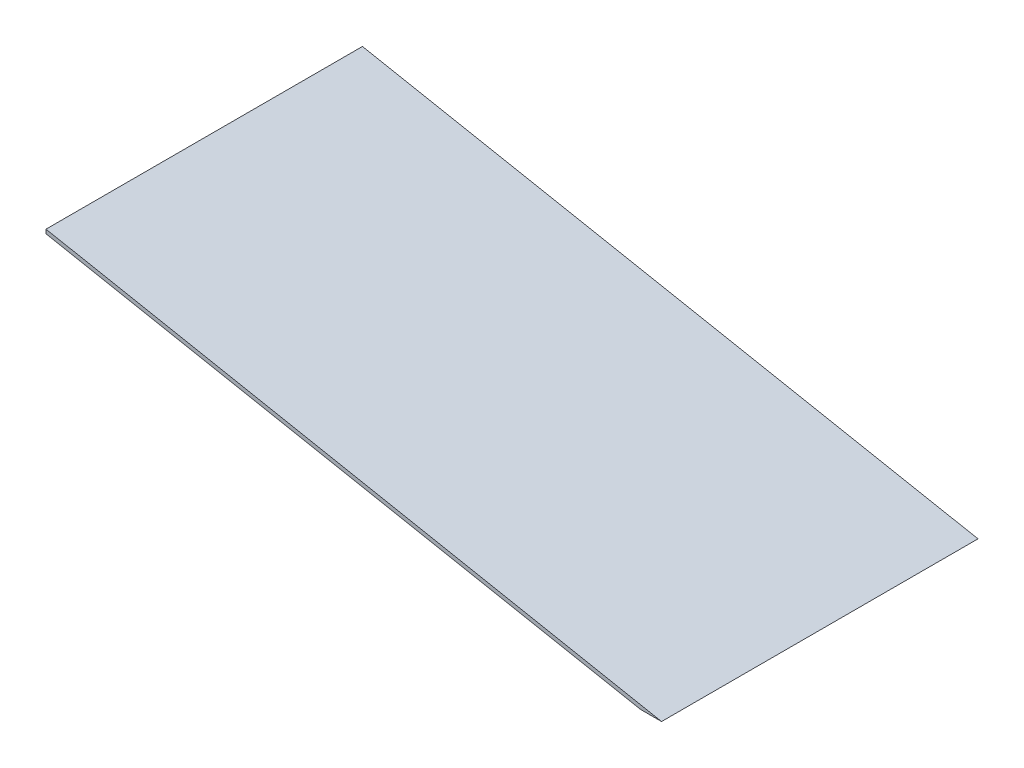
ISO-10303-21;
HEADER;
FILE_DESCRIPTION(('STEP AP214'),'2;1');
FILE_NAME('part.step','',(''),(''),'','','');
FILE_SCHEMA(('AUTOMOTIVE_DESIGN { 1 0 10303 214 1 1 1 1 }'));
ENDSEC;
DATA;
#1=APPLICATION_CONTEXT('core data for automotive mechanical design processes');
#2=APPLICATION_PROTOCOL_DEFINITION('international standard','automotive_design',2000,#1);
#3=PRODUCT_CONTEXT('',#1,'mechanical');
#4=PRODUCT('Part','Part','',(#3));
#5=PRODUCT_RELATED_PRODUCT_CATEGORY('part','',(#4));
#6=PRODUCT_DEFINITION_FORMATION('','',#4);
#7=PRODUCT_DEFINITION_CONTEXT('part definition',#1,'design');
#8=PRODUCT_DEFINITION('design','',#6,#7);
#9=PRODUCT_DEFINITION_SHAPE('','',#8);
#10=(LENGTH_UNIT() NAMED_UNIT(*) SI_UNIT(.MILLI.,.METRE.));
#11=(NAMED_UNIT(*) PLANE_ANGLE_UNIT() SI_UNIT($,.RADIAN.));
#12=(NAMED_UNIT(*) SI_UNIT($,.STERADIAN.) SOLID_ANGLE_UNIT());
#13=UNCERTAINTY_MEASURE_WITH_UNIT(LENGTH_MEASURE(1.E-05),#10,'distance_accuracy_value','');
#14=(GEOMETRIC_REPRESENTATION_CONTEXT(3) GLOBAL_UNCERTAINTY_ASSIGNED_CONTEXT((#13)) GLOBAL_UNIT_ASSIGNED_CONTEXT((#10,
#11,#12)) REPRESENTATION_CONTEXT('',''));
#15=CARTESIAN_POINT('',(0.,0.,0.));
#16=DIRECTION('',(0.,0.,1.));
#17=DIRECTION('',(1.,0.,0.));
#18=AXIS2_PLACEMENT_3D('',#15,#16,#17);
#19=CARTESIAN_POINT('',(778.009819163138,-0.00189315484661945,-0.01));
#20=DIRECTION('',(0.189315484661945,0.981916313779954,0.));
#21=DIRECTION('',(-0.981916313779954,0.189315484661945,0.));
#22=AXIS2_PLACEMENT_3D('',#19,#20,#21);
#23=PLANE('',#22);
#24=DIRECTION('',(-0.981916313779954,0.189315484661945,0.));
#25=VECTOR('',#24,1.);
#26=CARTESIAN_POINT('',(778.,0.,400.));
#27=LINE('',#26,#25);
#28=CARTESIAN_POINT('',(778.,0.,400.));
#29=VERTEX_POINT('',#28);
#30=CARTESIAN_POINT('',(0.,150.,400.));
#31=VERTEX_POINT('',#30);
#32=EDGE_CURVE('E71',#29,#31,#27,.T.);
#33=ORIENTED_EDGE('',*,*,#32,.F.);
#34=DIRECTION('',(0.,0.,1.));
#35=VECTOR('',#34,1.);
#36=CARTESIAN_POINT('',(778.,0.,200.));
#37=LINE('',#36,#35);
#38=CARTESIAN_POINT('',(778.,0.,0.));
#39=VERTEX_POINT('',#38);
#40=EDGE_CURVE('E61',#39,#29,#37,.T.);
#41=ORIENTED_EDGE('',*,*,#40,.F.);
#42=DIRECTION('',(0.981916313779954,-0.189315484661945,0.));
#43=VECTOR('',#42,1.);
#44=CARTESIAN_POINT('',(0.,150.,0.));
#45=LINE('',#44,#43);
#46=CARTESIAN_POINT('',(0.,150.,0.));
#47=VERTEX_POINT('',#46);
#48=EDGE_CURVE('E21',#47,#39,#45,.T.);
#49=ORIENTED_EDGE('',*,*,#48,.F.);
#50=DIRECTION('',(0.,0.,-1.));
#51=VECTOR('',#50,1.);
#52=CARTESIAN_POINT('',(0.,150.,200.));
#53=LINE('',#52,#51);
#54=EDGE_CURVE('E60',#31,#47,#53,.T.);
#55=ORIENTED_EDGE('',*,*,#54,.F.);
#56=EDGE_LOOP('',(#33,#41,#49,#55));
#57=FACE_BOUND('',#56,.T.);
#58=ADVANCED_FACE('F17',(#57),#23,.T.);
#59=CARTESIAN_POINT('',(778.01,-0.0100000000000033,0.));
#60=DIRECTION('',(0.,0.,-1.));
#61=DIRECTION('',(-1.,0.,0.));
#62=AXIS2_PLACEMENT_3D('',#59,#60,#61);
#63=PLANE('',#62);
#64=DIRECTION('',(0.,-1.,0.));
#65=VECTOR('',#64,1.);
#66=CARTESIAN_POINT('',(0.,147.453958178599,0.));
#67=LINE('',#66,#65);
#68=CARTESIAN_POINT('',(0.,144.907916357197,0.));
#69=VERTEX_POINT('',#68);
#70=EDGE_CURVE('E66',#47,#69,#67,.T.);
#71=ORIENTED_EDGE('',*,*,#70,.F.);
#72=ORIENTED_EDGE('',*,*,#48,.T.);
#73=DIRECTION('',(1.,0.,0.));
#74=VECTOR('',#73,1.);
#75=CARTESIAN_POINT('',(764.794529752999,0.,0.));
#76=LINE('',#75,#74);
#77=CARTESIAN_POINT('',(751.589059505997,0.,0.));
#78=VERTEX_POINT('',#77);
#79=EDGE_CURVE('E64',#78,#39,#76,.T.);
#80=ORIENTED_EDGE('',*,*,#79,.F.);
#81=DIRECTION('',(0.981916313779954,-0.189315484661945,0.));
#82=VECTOR('',#81,1.);
#83=CARTESIAN_POINT('',(375.794529752999,72.4539581785987,0.));
#84=LINE('',#83,#82);
#85=EDGE_CURVE('E69',#69,#78,#84,.T.);
#86=ORIENTED_EDGE('',*,*,#85,.F.);
#87=EDGE_LOOP('',(#71,#72,#80,#86));
#88=FACE_BOUND('',#87,.T.);
#89=ADVANCED_FACE('F67',(#88),#63,.T.);
#90=CARTESIAN_POINT('',(751.579059505997,0.,-0.01));
#91=DIRECTION('',(0.,-1.,0.));
#92=DIRECTION('',(1.,0.,0.));
#93=AXIS2_PLACEMENT_3D('',#90,#91,#92);
#94=PLANE('',#93);
#95=DIRECTION('',(1.,0.,0.));
#96=VECTOR('',#95,1.);
#97=CARTESIAN_POINT('',(389.,0.,400.));
#98=LINE('',#97,#96);
#99=CARTESIAN_POINT('',(751.589059505997,0.,400.));
#100=VERTEX_POINT('',#99);
#101=EDGE_CURVE('E80',#100,#29,#98,.T.);
#102=ORIENTED_EDGE('',*,*,#101,.F.);
#103=DIRECTION('',(0.,0.,1.));
#104=VECTOR('',#103,1.);
#105=CARTESIAN_POINT('',(751.589059505997,0.,200.));
#106=LINE('',#105,#104);
#107=EDGE_CURVE('E75',#78,#100,#106,.T.);
#108=ORIENTED_EDGE('',*,*,#107,.F.);
#109=ORIENTED_EDGE('',*,*,#79,.T.);
#110=ORIENTED_EDGE('',*,*,#40,.T.);
#111=EDGE_LOOP('',(#102,#108,#109,#110));
#112=FACE_BOUND('',#111,.T.);
#113=ADVANCED_FACE('F88',(#112),#94,.T.);
#114=CARTESIAN_POINT('',(-0.00999999999997669,-0.0100000000000033,400.));
#115=DIRECTION('',(0.,0.,1.));
#116=DIRECTION('',(1.,0.,0.));
#117=AXIS2_PLACEMENT_3D('',#114,#115,#116);
#118=PLANE('',#117);
#119=DIRECTION('',(0.,1.,0.));
#120=VECTOR('',#119,1.);
#121=CARTESIAN_POINT('',(0.,147.453958178599,400.));
#122=LINE('',#121,#120);
#123=CARTESIAN_POINT('',(0.,144.907916357197,400.));
#124=VERTEX_POINT('',#123);
#125=EDGE_CURVE('E36',#124,#31,#122,.T.);
#126=ORIENTED_EDGE('',*,*,#125,.F.);
#127=DIRECTION('',(-0.981916313779954,0.189315484661945,0.));
#128=VECTOR('',#127,1.);
#129=CARTESIAN_POINT('',(375.794529752999,72.4539581785987,400.));
#130=LINE('',#129,#128);
#131=EDGE_CURVE('E27',#100,#124,#130,.T.);
#132=ORIENTED_EDGE('',*,*,#131,.F.);
#133=ORIENTED_EDGE('',*,*,#101,.T.);
#134=ORIENTED_EDGE('',*,*,#32,.T.);
#135=EDGE_LOOP('',(#126,#132,#133,#134));
#136=FACE_BOUND('',#135,.T.);
#137=ADVANCED_FACE('F83',(#136),#118,.T.);
#138=CARTESIAN_POINT('',(0.,150.01,-0.01));
#139=DIRECTION('',(-1.,0.,0.));
#140=DIRECTION('',(0.,-1.,0.));
#141=AXIS2_PLACEMENT_3D('',#138,#139,#140);
#142=PLANE('',#141);
#143=ORIENTED_EDGE('',*,*,#125,.T.);
#144=ORIENTED_EDGE('',*,*,#54,.T.);
#145=ORIENTED_EDGE('',*,*,#70,.T.);
#146=DIRECTION('',(0.,0.,-1.));
#147=VECTOR('',#146,1.);
#148=CARTESIAN_POINT('',(0.,144.907916357197,200.));
#149=LINE('',#148,#147);
#150=EDGE_CURVE('E11',#124,#69,#149,.T.);
#151=ORIENTED_EDGE('',*,*,#150,.F.);
#152=EDGE_LOOP('',(#143,#144,#145,#151));
#153=FACE_BOUND('',#152,.T.);
#154=ADVANCED_FACE('F73',(#153),#142,.T.);
#155=CARTESIAN_POINT('',(-0.00981916313779954,144.909809512044,-0.01));
#156=DIRECTION('',(-0.189315484661945,-0.981916313779954,0.));
#157=DIRECTION('',(0.981916313779954,-0.189315484661945,0.));
#158=AXIS2_PLACEMENT_3D('',#155,#156,#157);
#159=PLANE('',#158);
#160=ORIENTED_EDGE('',*,*,#131,.T.);
#161=ORIENTED_EDGE('',*,*,#150,.T.);
#162=ORIENTED_EDGE('',*,*,#85,.T.);
#163=ORIENTED_EDGE('',*,*,#107,.T.);
#164=EDGE_LOOP('',(#160,#161,#162,#163));
#165=FACE_BOUND('',#164,.T.);
#166=ADVANCED_FACE('F19',(#165),#159,.T.);
#167=CLOSED_SHELL('',(#58,#89,#113,#137,#154,#166));
#168=MANIFOLD_SOLID_BREP('B1',#167);
#169=ADVANCED_BREP_SHAPE_REPRESENTATION('',(#18,#168),#14);
#170=SHAPE_DEFINITION_REPRESENTATION(#9,#169);
ENDSEC;
END-ISO-10303-21;
